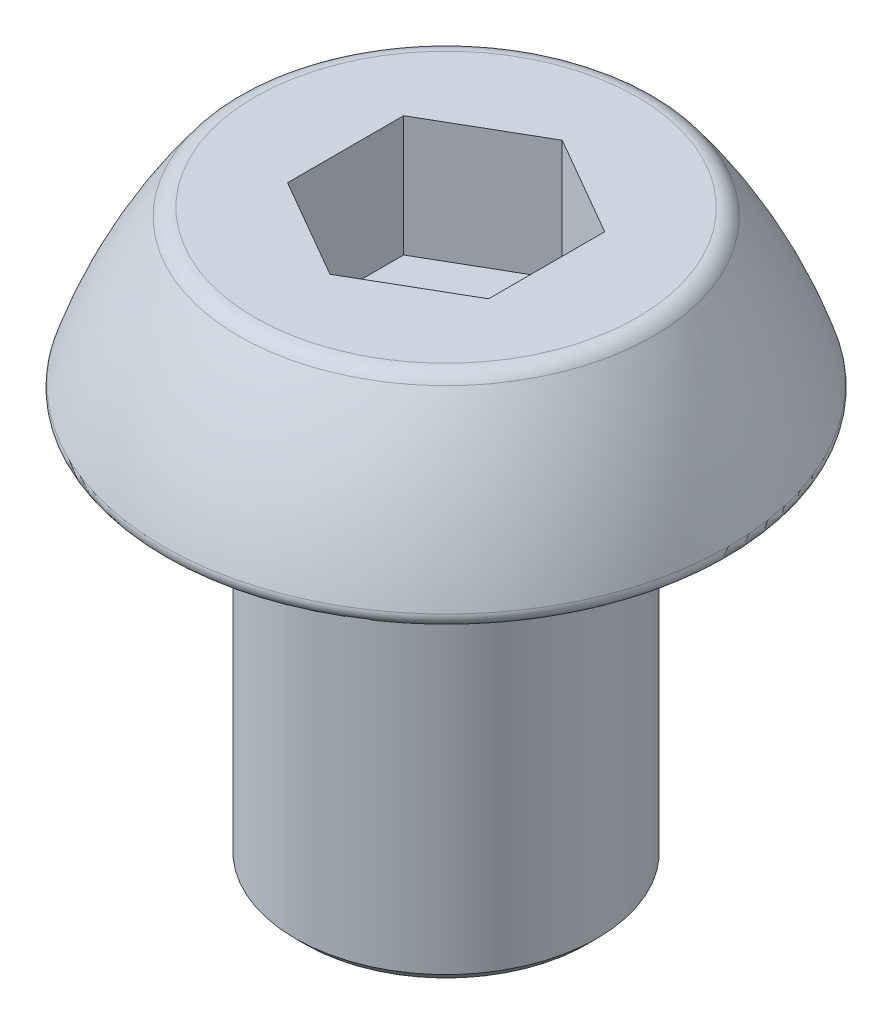
ISO-10303-21;
HEADER;
FILE_DESCRIPTION(('STEP AP214'),'2;1');
FILE_NAME('part.step','',(''),(''),'','','');
FILE_SCHEMA(('AUTOMOTIVE_DESIGN { 1 0 10303 214 1 1 1 1 }'));
ENDSEC;
DATA;
#1=APPLICATION_CONTEXT('core data for automotive mechanical design processes');
#2=APPLICATION_PROTOCOL_DEFINITION('international standard','automotive_design',2000,#1);
#3=PRODUCT_CONTEXT('',#1,'mechanical');
#4=PRODUCT('Part','Part','',(#3));
#5=PRODUCT_RELATED_PRODUCT_CATEGORY('part','',(#4));
#6=PRODUCT_DEFINITION_FORMATION('','',#4);
#7=PRODUCT_DEFINITION_CONTEXT('part definition',#1,'design');
#8=PRODUCT_DEFINITION('design','',#6,#7);
#9=PRODUCT_DEFINITION_SHAPE('','',#8);
#10=(LENGTH_UNIT() NAMED_UNIT(*) SI_UNIT(.MILLI.,.METRE.));
#11=(NAMED_UNIT(*) PLANE_ANGLE_UNIT() SI_UNIT($,.RADIAN.));
#12=(NAMED_UNIT(*) SI_UNIT($,.STERADIAN.) SOLID_ANGLE_UNIT());
#13=UNCERTAINTY_MEASURE_WITH_UNIT(LENGTH_MEASURE(1.E-05),#10,'distance_accuracy_value','');
#14=(GEOMETRIC_REPRESENTATION_CONTEXT(3) GLOBAL_UNCERTAINTY_ASSIGNED_CONTEXT((#13)) GLOBAL_UNIT_ASSIGNED_CONTEXT((#10,
#11,#12)) REPRESENTATION_CONTEXT('',''));
#15=CARTESIAN_POINT('',(0.,0.,0.));
#16=DIRECTION('',(0.,0.,1.));
#17=DIRECTION('',(1.,0.,0.));
#18=AXIS2_PLACEMENT_3D('',#15,#16,#17);
#19=CARTESIAN_POINT('',(0.,0.,0.));
#20=DIRECTION('',(0.,1.,0.));
#21=DIRECTION('',(0.,0.,1.));
#22=AXIS2_PLACEMENT_3D('',#19,#20,#21);
#23=PLANE('',#22);
#24=CARTESIAN_POINT('',(0.,0.,0.));
#25=DIRECTION('',(0.,1.,0.));
#26=DIRECTION('',(0.,0.,1.));
#27=AXIS2_PLACEMENT_3D('',#24,#25,#26);
#28=CIRCLE('',#27,2.71401101775283);
#29=CARTESIAN_POINT('',(0.,0.,2.71401101775283));
#30=VERTEX_POINT('',#29);
#31=EDGE_CURVE('E118',#30,#30,#28,.F.);
#32=ORIENTED_EDGE('',*,*,#31,.T.);
#33=EDGE_LOOP('',(#32));
#34=FACE_BOUND('',#33,.T.);
#35=CARTESIAN_POINT('',(0.,0.,0.));
#36=DIRECTION('',(0.,1.,0.));
#37=DIRECTION('',(0.,0.,1.));
#38=AXIS2_PLACEMENT_3D('',#35,#36,#37);
#39=CIRCLE('',#38,1.5);
#40=CARTESIAN_POINT('',(0.,0.,1.5));
#41=VERTEX_POINT('',#40);
#42=EDGE_CURVE('E137',#41,#41,#39,.F.);
#43=ORIENTED_EDGE('',*,*,#42,.F.);
#44=EDGE_LOOP('',(#43));
#45=FACE_BOUND('',#44,.T.);
#46=ADVANCED_FACE('F17',(#34,#45),#23,.F.);
#47=CARTESIAN_POINT('',(-2.,1.65,0.));
#48=DIRECTION('',(0.,-1.,0.));
#49=DIRECTION('',(0.,0.,-1.));
#50=AXIS2_PLACEMENT_3D('',#47,#48,#49);
#51=PLANE('',#50);
#52=DIRECTION('',(-0.866025403784439,0.,0.5));
#53=VECTOR('',#52,1.);
#54=CARTESIAN_POINT('',(0.,1.65,-1.15470053837925));
#55=LINE('',#54,#53);
#56=CARTESIAN_POINT('',(0.,1.65,-1.15470053837925));
#57=VERTEX_POINT('',#56);
#58=CARTESIAN_POINT('',(-1.,1.65,-0.577350269189626));
#59=VERTEX_POINT('',#58);
#60=EDGE_CURVE('E106',#57,#59,#55,.T.);
#61=ORIENTED_EDGE('',*,*,#60,.F.);
#62=DIRECTION('',(-0.866025403784439,0.,-0.5));
#63=VECTOR('',#62,1.);
#64=CARTESIAN_POINT('',(1.,1.65,-0.577350269189626));
#65=LINE('',#64,#63);
#66=CARTESIAN_POINT('',(1.,1.65,-0.577350269189626));
#67=VERTEX_POINT('',#66);
#68=EDGE_CURVE('E32',#67,#57,#65,.T.);
#69=ORIENTED_EDGE('',*,*,#68,.F.);
#70=DIRECTION('',(0.,0.,-1.));
#71=VECTOR('',#70,1.);
#72=CARTESIAN_POINT('',(1.,1.65,0.577350269189626));
#73=LINE('',#72,#71);
#74=CARTESIAN_POINT('',(1.,1.65,0.577350269189626));
#75=VERTEX_POINT('',#74);
#76=EDGE_CURVE('E113',#75,#67,#73,.T.);
#77=ORIENTED_EDGE('',*,*,#76,.F.);
#78=DIRECTION('',(0.866025403784439,0.,-0.5));
#79=VECTOR('',#78,1.);
#80=CARTESIAN_POINT('',(0.,1.65,1.15470053837925));
#81=LINE('',#80,#79);
#82=CARTESIAN_POINT('',(0.,1.65,1.15470053837925));
#83=VERTEX_POINT('',#82);
#84=EDGE_CURVE('E114',#83,#75,#81,.T.);
#85=ORIENTED_EDGE('',*,*,#84,.F.);
#86=DIRECTION('',(0.866025403784439,0.,0.5));
#87=VECTOR('',#86,1.);
#88=CARTESIAN_POINT('',(-1.,1.65,0.577350269189626));
#89=LINE('',#88,#87);
#90=CARTESIAN_POINT('',(-1.,1.65,0.577350269189626));
#91=VERTEX_POINT('',#90);
#92=EDGE_CURVE('E79',#91,#83,#89,.T.);
#93=ORIENTED_EDGE('',*,*,#92,.F.);
#94=DIRECTION('',(0.,0.,1.));
#95=VECTOR('',#94,1.);
#96=CARTESIAN_POINT('',(-1.,1.65,-0.577350269189626));
#97=LINE('',#96,#95);
#98=EDGE_CURVE('E108',#59,#91,#97,.T.);
#99=ORIENTED_EDGE('',*,*,#98,.F.);
#100=EDGE_LOOP('',(#61,#69,#77,#85,#93,#99));
#101=FACE_BOUND('',#100,.T.);
#102=CARTESIAN_POINT('',(0.,1.65,0.));
#103=DIRECTION('',(0.,-1.,0.));
#104=DIRECTION('',(0.,0.,-1.));
#105=AXIS2_PLACEMENT_3D('',#102,#103,#104);
#106=CIRCLE('',#105,1.90110924353599);
#107=CARTESIAN_POINT('',(0.,1.65,-1.90110924353599));
#108=VERTEX_POINT('',#107);
#109=EDGE_CURVE('E132',#108,#108,#106,.F.);
#110=ORIENTED_EDGE('',*,*,#109,.T.);
#111=EDGE_LOOP('',(#110));
#112=FACE_BOUND('',#111,.T.);
#113=ADVANCED_FACE('F152',(#101,#112),#51,.F.);
#114=CARTESIAN_POINT('',(0.,-1.42499576680782,0.));
#115=DIRECTION('',(0.,-1.,0.));
#116=DIRECTION('',(0.,0.,-1.));
#117=AXIS2_PLACEMENT_3D('',#114,#115,#116);
#118=DEGENERATE_TOROIDAL_SURFACE('',#117,1.94263884145048,5.,.F.);
#119=CARTESIAN_POINT('',(0.,1.56979149028366,0.));
#120=DIRECTION('',(0.,-1.,0.));
#121=DIRECTION('',(0.,0.,-1.));
#122=AXIS2_PLACEMENT_3D('',#119,#120,#121);
#123=CIRCLE('',#122,2.06126541374375);
#124=CARTESIAN_POINT('',(0.,1.56979149028366,-2.06126541374375));
#125=VERTEX_POINT('',#124);
#126=EDGE_CURVE('E129',#125,#125,#123,.T.);
#127=ORIENTED_EDGE('',*,*,#126,.T.);
#128=EDGE_LOOP('',(#127));
#129=FACE_BOUND('',#128,.T.);
#130=CARTESIAN_POINT('',(0.,0.131122362587915,0.));
#131=DIRECTION('',(0.,-1.,0.));
#132=DIRECTION('',(0.,0.,-1.));
#133=AXIS2_PLACEMENT_3D('',#130,#131,#132);
#134=CIRCLE('',#133,2.80904468834882);
#135=CARTESIAN_POINT('',(0.,0.131122362587915,-2.80904468834882));
#136=VERTEX_POINT('',#135);
#137=EDGE_CURVE('E126',#136,#136,#134,.F.);
#138=ORIENTED_EDGE('',*,*,#137,.T.);
#139=EDGE_LOOP('',(#138));
#140=FACE_BOUND('',#139,.T.);
#141=ADVANCED_FACE('F161',(#129,#140),#118,.F.);
#142=CARTESIAN_POINT('',(0.,0.1,0.));
#143=DIRECTION('',(0.,1.,0.));
#144=DIRECTION('',(0.,0.,1.));
#145=AXIS2_PLACEMENT_3D('',#142,#143,#144);
#146=TOROIDAL_SURFACE('',#145,2.71401101775283,0.1);
#147=ORIENTED_EDGE('',*,*,#137,.F.);
#148=EDGE_LOOP('',(#147));
#149=FACE_BOUND('',#148,.T.);
#150=ORIENTED_EDGE('',*,*,#31,.F.);
#151=EDGE_LOOP('',(#150));
#152=FACE_BOUND('',#151,.T.);
#153=ADVANCED_FACE('F168',(#149,#152),#146,.T.);
#154=CARTESIAN_POINT('',(0.,1.45,0.));
#155=DIRECTION('',(0.,-1.,0.));
#156=DIRECTION('',(0.,0.,-1.));
#157=AXIS2_PLACEMENT_3D('',#154,#155,#156);
#158=TOROIDAL_SURFACE('',#157,1.90110924353599,0.2);
#159=ORIENTED_EDGE('',*,*,#109,.F.);
#160=EDGE_LOOP('',(#159));
#161=FACE_BOUND('',#160,.T.);
#162=ORIENTED_EDGE('',*,*,#126,.F.);
#163=EDGE_LOOP('',(#162));
#164=FACE_BOUND('',#163,.T.);
#165=ADVANCED_FACE('F173',(#161,#164),#158,.T.);
#166=CARTESIAN_POINT('',(1.,0.45,-0.577350269189626));
#167=DIRECTION('',(0.5,0.,-0.866025403784439));
#168=DIRECTION('',(-0.866025403784439,0.,-0.5));
#169=AXIS2_PLACEMENT_3D('',#166,#167,#168);
#170=PLANE('',#169);
#171=ORIENTED_EDGE('',*,*,#68,.T.);
#172=DIRECTION('',(0.,1.,0.));
#173=VECTOR('',#172,1.);
#174=CARTESIAN_POINT('',(0.,0.45,-1.15470053837925));
#175=LINE('',#174,#173);
#176=CARTESIAN_POINT('',(0.,0.45,-1.15470053837925));
#177=VERTEX_POINT('',#176);
#178=EDGE_CURVE('E62',#177,#57,#175,.T.);
#179=ORIENTED_EDGE('',*,*,#178,.F.);
#180=DIRECTION('',(-0.866025403784439,0.,-0.5));
#181=VECTOR('',#180,1.);
#182=CARTESIAN_POINT('',(1.,0.45,-0.577350269189626));
#183=LINE('',#182,#181);
#184=CARTESIAN_POINT('',(1.,0.45,-0.577350269189626));
#185=VERTEX_POINT('',#184);
#186=EDGE_CURVE('E117',#185,#177,#183,.T.);
#187=ORIENTED_EDGE('',*,*,#186,.F.);
#188=DIRECTION('',(0.,1.,0.));
#189=VECTOR('',#188,1.);
#190=CARTESIAN_POINT('',(1.,0.45,-0.577350269189626));
#191=LINE('',#190,#189);
#192=EDGE_CURVE('E37',#185,#67,#191,.T.);
#193=ORIENTED_EDGE('',*,*,#192,.T.);
#194=EDGE_LOOP('',(#171,#179,#187,#193));
#195=FACE_BOUND('',#194,.T.);
#196=ADVANCED_FACE('F170',(#195),#170,.F.);
#197=CARTESIAN_POINT('',(1.,0.45,0.577350269189626));
#198=DIRECTION('',(1.,0.,0.));
#199=DIRECTION('',(0.,0.,-1.));
#200=AXIS2_PLACEMENT_3D('',#197,#198,#199);
#201=PLANE('',#200);
#202=ORIENTED_EDGE('',*,*,#76,.T.);
#203=ORIENTED_EDGE('',*,*,#192,.F.);
#204=DIRECTION('',(0.,0.,-1.));
#205=VECTOR('',#204,1.);
#206=CARTESIAN_POINT('',(1.,0.45,0.577350269189626));
#207=LINE('',#206,#205);
#208=CARTESIAN_POINT('',(1.,0.45,0.577350269189626));
#209=VERTEX_POINT('',#208);
#210=EDGE_CURVE('E95',#209,#185,#207,.T.);
#211=ORIENTED_EDGE('',*,*,#210,.F.);
#212=DIRECTION('',(0.,1.,0.));
#213=VECTOR('',#212,1.);
#214=CARTESIAN_POINT('',(1.,0.45,0.577350269189626));
#215=LINE('',#214,#213);
#216=EDGE_CURVE('E81',#209,#75,#215,.T.);
#217=ORIENTED_EDGE('',*,*,#216,.T.);
#218=EDGE_LOOP('',(#202,#203,#211,#217));
#219=FACE_BOUND('',#218,.T.);
#220=ADVANCED_FACE('F181',(#219),#201,.F.);
#221=CARTESIAN_POINT('',(0.,0.45,1.15470053837925));
#222=DIRECTION('',(0.5,0.,0.866025403784439));
#223=DIRECTION('',(0.866025403784439,0.,-0.5));
#224=AXIS2_PLACEMENT_3D('',#221,#222,#223);
#225=PLANE('',#224);
#226=ORIENTED_EDGE('',*,*,#84,.T.);
#227=ORIENTED_EDGE('',*,*,#216,.F.);
#228=DIRECTION('',(0.866025403784439,0.,-0.5));
#229=VECTOR('',#228,1.);
#230=CARTESIAN_POINT('',(0.,0.45,1.15470053837925));
#231=LINE('',#230,#229);
#232=CARTESIAN_POINT('',(0.,0.45,1.15470053837925));
#233=VERTEX_POINT('',#232);
#234=EDGE_CURVE('E86',#233,#209,#231,.T.);
#235=ORIENTED_EDGE('',*,*,#234,.F.);
#236=DIRECTION('',(0.,1.,0.));
#237=VECTOR('',#236,1.);
#238=CARTESIAN_POINT('',(0.,0.45,1.15470053837925));
#239=LINE('',#238,#237);
#240=EDGE_CURVE('E73',#233,#83,#239,.T.);
#241=ORIENTED_EDGE('',*,*,#240,.T.);
#242=EDGE_LOOP('',(#226,#227,#235,#241));
#243=FACE_BOUND('',#242,.T.);
#244=ADVANCED_FACE('F90',(#243),#225,.F.);
#245=CARTESIAN_POINT('',(-1.,0.45,0.577350269189626));
#246=DIRECTION('',(-0.5,0.,0.866025403784439));
#247=DIRECTION('',(0.866025403784439,0.,0.5));
#248=AXIS2_PLACEMENT_3D('',#245,#246,#247);
#249=PLANE('',#248);
#250=ORIENTED_EDGE('',*,*,#92,.T.);
#251=ORIENTED_EDGE('',*,*,#240,.F.);
#252=DIRECTION('',(0.866025403784439,0.,0.5));
#253=VECTOR('',#252,1.);
#254=CARTESIAN_POINT('',(-1.,0.45,0.577350269189626));
#255=LINE('',#254,#253);
#256=CARTESIAN_POINT('',(-1.,0.45,0.577350269189626));
#257=VERTEX_POINT('',#256);
#258=EDGE_CURVE('E80',#257,#233,#255,.T.);
#259=ORIENTED_EDGE('',*,*,#258,.F.);
#260=DIRECTION('',(0.,1.,0.));
#261=VECTOR('',#260,1.);
#262=CARTESIAN_POINT('',(-1.,0.45,0.577350269189626));
#263=LINE('',#262,#261);
#264=EDGE_CURVE('E83',#257,#91,#263,.T.);
#265=ORIENTED_EDGE('',*,*,#264,.T.);
#266=EDGE_LOOP('',(#250,#251,#259,#265));
#267=FACE_BOUND('',#266,.T.);
#268=ADVANCED_FACE('F74',(#267),#249,.F.);
#269=CARTESIAN_POINT('',(-1.,0.45,-0.577350269189626));
#270=DIRECTION('',(-1.,0.,0.));
#271=DIRECTION('',(0.,0.,1.));
#272=AXIS2_PLACEMENT_3D('',#269,#270,#271);
#273=PLANE('',#272);
#274=ORIENTED_EDGE('',*,*,#98,.T.);
#275=ORIENTED_EDGE('',*,*,#264,.F.);
#276=DIRECTION('',(0.,0.,1.));
#277=VECTOR('',#276,1.);
#278=CARTESIAN_POINT('',(-1.,0.45,-0.577350269189626));
#279=LINE('',#278,#277);
#280=CARTESIAN_POINT('',(-1.,0.45,-0.577350269189626));
#281=VERTEX_POINT('',#280);
#282=EDGE_CURVE('E98',#281,#257,#279,.T.);
#283=ORIENTED_EDGE('',*,*,#282,.F.);
#284=DIRECTION('',(0.,1.,0.));
#285=VECTOR('',#284,1.);
#286=CARTESIAN_POINT('',(-1.,0.45,-0.577350269189626));
#287=LINE('',#286,#285);
#288=EDGE_CURVE('E121',#281,#59,#287,.T.);
#289=ORIENTED_EDGE('',*,*,#288,.T.);
#290=EDGE_LOOP('',(#274,#275,#283,#289));
#291=FACE_BOUND('',#290,.T.);
#292=ADVANCED_FACE('F206',(#291),#273,.F.);
#293=CARTESIAN_POINT('',(0.,0.45,-1.15470053837925));
#294=DIRECTION('',(-0.5,0.,-0.866025403784439));
#295=DIRECTION('',(-0.866025403784439,0.,0.5));
#296=AXIS2_PLACEMENT_3D('',#293,#294,#295);
#297=PLANE('',#296);
#298=ORIENTED_EDGE('',*,*,#60,.T.);
#299=ORIENTED_EDGE('',*,*,#288,.F.);
#300=DIRECTION('',(-0.866025403784439,0.,0.5));
#301=VECTOR('',#300,1.);
#302=CARTESIAN_POINT('',(0.,0.45,-1.15470053837925));
#303=LINE('',#302,#301);
#304=EDGE_CURVE('E99',#177,#281,#303,.T.);
#305=ORIENTED_EDGE('',*,*,#304,.F.);
#306=ORIENTED_EDGE('',*,*,#178,.T.);
#307=EDGE_LOOP('',(#298,#299,#305,#306));
#308=FACE_BOUND('',#307,.T.);
#309=ADVANCED_FACE('F208',(#308),#297,.F.);
#310=CARTESIAN_POINT('',(0.,0.45,0.));
#311=DIRECTION('',(0.,1.,0.));
#312=DIRECTION('',(0.,0.,1.));
#313=AXIS2_PLACEMENT_3D('',#310,#311,#312);
#314=PLANE('',#313);
#315=ORIENTED_EDGE('',*,*,#186,.T.);
#316=ORIENTED_EDGE('',*,*,#304,.T.);
#317=ORIENTED_EDGE('',*,*,#282,.T.);
#318=ORIENTED_EDGE('',*,*,#258,.T.);
#319=ORIENTED_EDGE('',*,*,#234,.T.);
#320=ORIENTED_EDGE('',*,*,#210,.T.);
#321=EDGE_LOOP('',(#315,#316,#317,#318,#319,#320));
#322=FACE_BOUND('',#321,.T.);
#323=ADVANCED_FACE('F92',(#322),#314,.T.);
#324=CARTESIAN_POINT('',(0.,-4.,0.));
#325=DIRECTION('',(0.,1.,0.));
#326=DIRECTION('',(0.,0.,1.));
#327=AXIS2_PLACEMENT_3D('',#324,#325,#326);
#328=CYLINDRICAL_SURFACE('',#327,1.5);
#329=CARTESIAN_POINT('',(0.,-3.9,0.));
#330=DIRECTION('',(0.,-1.,0.));
#331=DIRECTION('',(0.,0.,-1.));
#332=AXIS2_PLACEMENT_3D('',#329,#330,#331);
#333=CIRCLE('',#332,1.5);
#334=CARTESIAN_POINT('',(0.,-3.9,-1.5));
#335=VERTEX_POINT('',#334);
#336=EDGE_CURVE('E11',#335,#335,#333,.F.);
#337=ORIENTED_EDGE('',*,*,#336,.T.);
#338=EDGE_LOOP('',(#337));
#339=FACE_BOUND('',#338,.T.);
#340=ORIENTED_EDGE('',*,*,#42,.T.);
#341=EDGE_LOOP('',(#340));
#342=FACE_BOUND('',#341,.T.);
#343=ADVANCED_FACE('F147',(#339,#342),#328,.T.);
#344=CARTESIAN_POINT('',(0.,-4.,0.));
#345=DIRECTION('',(0.,-1.,0.));
#346=DIRECTION('',(0.,0.,-1.));
#347=AXIS2_PLACEMENT_3D('',#344,#345,#346);
#348=PLANE('',#347);
#349=CARTESIAN_POINT('',(0.,-4.,0.));
#350=DIRECTION('',(0.,-1.,0.));
#351=DIRECTION('',(0.,0.,-1.));
#352=AXIS2_PLACEMENT_3D('',#349,#350,#351);
#353=CIRCLE('',#352,1.4);
#354=CARTESIAN_POINT('',(0.,-4.,-1.4));
#355=VERTEX_POINT('',#354);
#356=EDGE_CURVE('E25',#355,#355,#353,.T.);
#357=ORIENTED_EDGE('',*,*,#356,.T.);
#358=EDGE_LOOP('',(#357));
#359=FACE_BOUND('',#358,.T.);
#360=ADVANCED_FACE('F143',(#359),#348,.T.);
#361=CARTESIAN_POINT('',(0.,-4.,0.));
#362=DIRECTION('',(0.,1.,0.));
#363=DIRECTION('',(0.,0.,1.));
#364=AXIS2_PLACEMENT_3D('',#361,#362,#363);
#365=CONICAL_SURFACE('',#364,1.4,0.785398163397455);
#366=ORIENTED_EDGE('',*,*,#336,.F.);
#367=EDGE_LOOP('',(#366));
#368=FACE_BOUND('',#367,.T.);
#369=ORIENTED_EDGE('',*,*,#356,.F.);
#370=EDGE_LOOP('',(#369));
#371=FACE_BOUND('',#370,.T.);
#372=ADVANCED_FACE('F19',(#368,#371),#365,.T.);
#373=CLOSED_SHELL('',(#46,#113,#141,#153,#165,#196,#220,#244,#268,#292,#309,#323,#343,#360,#372));
#374=MANIFOLD_SOLID_BREP('B1',#373);
#375=ADVANCED_BREP_SHAPE_REPRESENTATION('',(#18,#374),#14);
#376=SHAPE_DEFINITION_REPRESENTATION(#9,#375);
ENDSEC;
END-ISO-10303-21;
